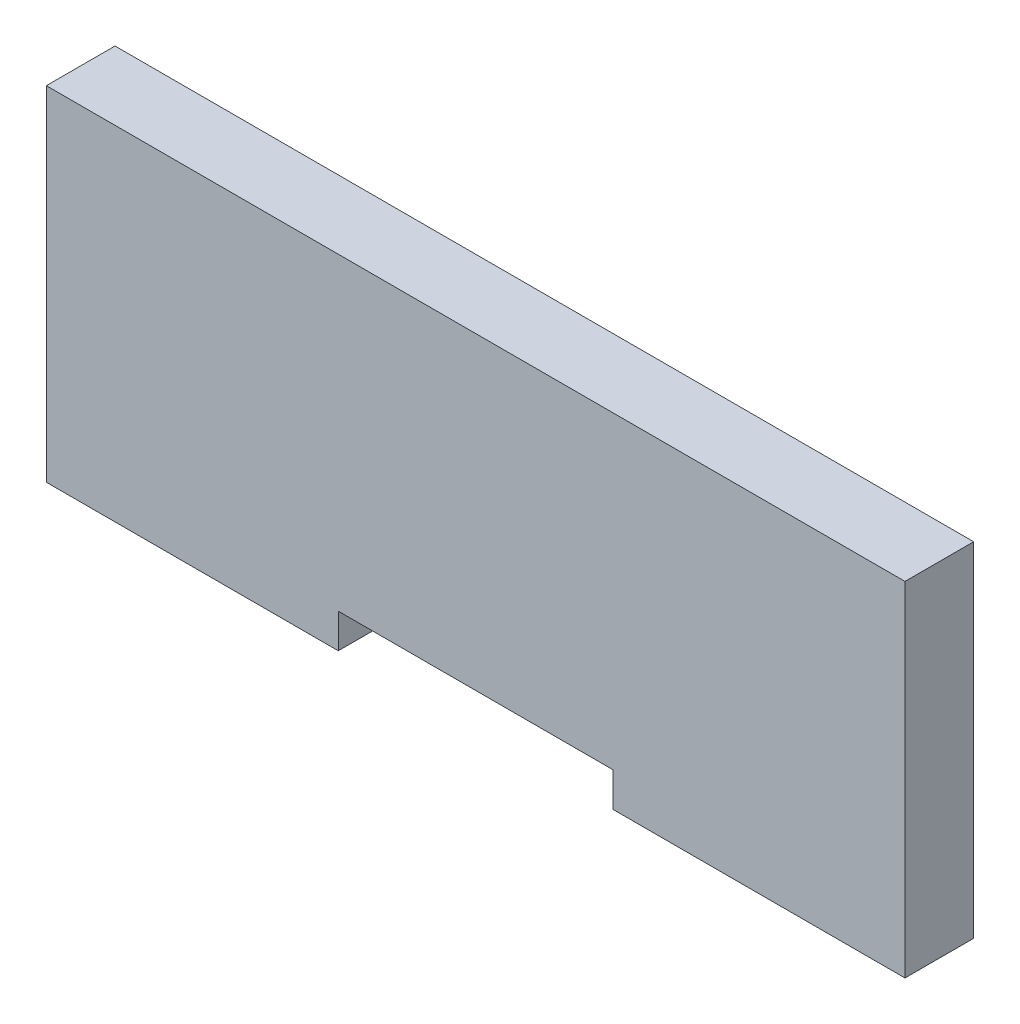
ISO-10303-21;
HEADER;
FILE_DESCRIPTION(('STEP AP214'),'2;1');
FILE_NAME('part.step','',(''),(''),'','','');
FILE_SCHEMA(('AUTOMOTIVE_DESIGN { 1 0 10303 214 1 1 1 1 }'));
ENDSEC;
DATA;
#1=APPLICATION_CONTEXT('core data for automotive mechanical design processes');
#2=APPLICATION_PROTOCOL_DEFINITION('international standard','automotive_design',2000,#1);
#3=PRODUCT_CONTEXT('',#1,'mechanical');
#4=PRODUCT('Part','Part','',(#3));
#5=PRODUCT_RELATED_PRODUCT_CATEGORY('part','',(#4));
#6=PRODUCT_DEFINITION_FORMATION('','',#4);
#7=PRODUCT_DEFINITION_CONTEXT('part definition',#1,'design');
#8=PRODUCT_DEFINITION('design','',#6,#7);
#9=PRODUCT_DEFINITION_SHAPE('','',#8);
#10=(LENGTH_UNIT() NAMED_UNIT(*) SI_UNIT(.MILLI.,.METRE.));
#11=(NAMED_UNIT(*) PLANE_ANGLE_UNIT() SI_UNIT($,.RADIAN.));
#12=(NAMED_UNIT(*) SI_UNIT($,.STERADIAN.) SOLID_ANGLE_UNIT());
#13=UNCERTAINTY_MEASURE_WITH_UNIT(LENGTH_MEASURE(1.E-05),#10,'distance_accuracy_value','');
#14=(GEOMETRIC_REPRESENTATION_CONTEXT(3) GLOBAL_UNCERTAINTY_ASSIGNED_CONTEXT((#13)) GLOBAL_UNIT_ASSIGNED_CONTEXT((#10,
#11,#12)) REPRESENTATION_CONTEXT('',''));
#15=CARTESIAN_POINT('',(0.,0.,0.));
#16=DIRECTION('',(0.,0.,1.));
#17=DIRECTION('',(1.,0.,0.));
#18=AXIS2_PLACEMENT_3D('',#15,#16,#17);
#19=CARTESIAN_POINT('',(-125.,-50.,20.));
#20=DIRECTION('',(1.,0.,0.));
#21=DIRECTION('',(0.,0.,-1.));
#22=AXIS2_PLACEMENT_3D('',#19,#20,#21);
#23=PLANE('',#22);
#24=DIRECTION('',(0.,-1.,0.));
#25=VECTOR('',#24,1.);
#26=CARTESIAN_POINT('',(-125.,-50.,0.));
#27=LINE('',#26,#25);
#28=CARTESIAN_POINT('',(-125.,50.,0.));
#29=VERTEX_POINT('',#28);
#30=CARTESIAN_POINT('',(-125.,-50.,0.));
#31=VERTEX_POINT('',#30);
#32=EDGE_CURVE('E147',#29,#31,#27,.T.);
#33=ORIENTED_EDGE('',*,*,#32,.T.);
#34=DIRECTION('',(0.,0.,-1.));
#35=VECTOR('',#34,1.);
#36=CARTESIAN_POINT('',(-125.,-50.,20.));
#37=LINE('',#36,#35);
#38=CARTESIAN_POINT('',(-125.,-50.,20.));
#39=VERTEX_POINT('',#38);
#40=EDGE_CURVE('E11',#39,#31,#37,.T.);
#41=ORIENTED_EDGE('',*,*,#40,.F.);
#42=DIRECTION('',(0.,-1.,0.));
#43=VECTOR('',#42,1.);
#44=CARTESIAN_POINT('',(-125.,-50.,20.));
#45=LINE('',#44,#43);
#46=CARTESIAN_POINT('',(-125.,50.,20.));
#47=VERTEX_POINT('',#46);
#48=EDGE_CURVE('E166',#47,#39,#45,.T.);
#49=ORIENTED_EDGE('',*,*,#48,.F.);
#50=DIRECTION('',(0.,0.,-1.));
#51=VECTOR('',#50,1.);
#52=CARTESIAN_POINT('',(-125.,50.,20.));
#53=LINE('',#52,#51);
#54=EDGE_CURVE('E145',#47,#29,#53,.T.);
#55=ORIENTED_EDGE('',*,*,#54,.T.);
#56=EDGE_LOOP('',(#33,#41,#49,#55));
#57=FACE_BOUND('',#56,.T.);
#58=ADVANCED_FACE('F44',(#57),#23,.F.);
#59=CARTESIAN_POINT('',(-40.,-50.,20.));
#60=DIRECTION('',(0.,1.,0.));
#61=DIRECTION('',(-1.,0.,0.));
#62=AXIS2_PLACEMENT_3D('',#59,#60,#61);
#63=PLANE('',#62);
#64=DIRECTION('',(1.,0.,0.));
#65=VECTOR('',#64,1.);
#66=CARTESIAN_POINT('',(-40.,-50.,0.));
#67=LINE('',#66,#65);
#68=CARTESIAN_POINT('',(-40.,-50.,0.));
#69=VERTEX_POINT('',#68);
#70=EDGE_CURVE('E148',#31,#69,#67,.T.);
#71=ORIENTED_EDGE('',*,*,#70,.T.);
#72=DIRECTION('',(0.,0.,-1.));
#73=VECTOR('',#72,1.);
#74=CARTESIAN_POINT('',(-40.,-50.,20.));
#75=LINE('',#74,#73);
#76=CARTESIAN_POINT('',(-40.,-50.,20.));
#77=VERTEX_POINT('',#76);
#78=EDGE_CURVE('E53',#77,#69,#75,.T.);
#79=ORIENTED_EDGE('',*,*,#78,.F.);
#80=DIRECTION('',(1.,0.,0.));
#81=VECTOR('',#80,1.);
#82=CARTESIAN_POINT('',(-40.,-50.,20.));
#83=LINE('',#82,#81);
#84=EDGE_CURVE('E103',#39,#77,#83,.T.);
#85=ORIENTED_EDGE('',*,*,#84,.F.);
#86=ORIENTED_EDGE('',*,*,#40,.T.);
#87=EDGE_LOOP('',(#71,#79,#85,#86));
#88=FACE_BOUND('',#87,.T.);
#89=ADVANCED_FACE('F215',(#88),#63,.F.);
#90=CARTESIAN_POINT('',(-40.,-50.,20.));
#91=DIRECTION('',(-1.,0.,0.));
#92=DIRECTION('',(0.,-1.,0.));
#93=AXIS2_PLACEMENT_3D('',#90,#91,#92);
#94=PLANE('',#93);
#95=DIRECTION('',(0.,1.,0.));
#96=VECTOR('',#95,1.);
#97=CARTESIAN_POINT('',(-40.,-50.,0.));
#98=LINE('',#97,#96);
#99=CARTESIAN_POINT('',(-40.,-40.,0.));
#100=VERTEX_POINT('',#99);
#101=EDGE_CURVE('E154',#69,#100,#98,.T.);
#102=ORIENTED_EDGE('',*,*,#101,.T.);
#103=DIRECTION('',(0.,0.,-1.));
#104=VECTOR('',#103,1.);
#105=CARTESIAN_POINT('',(-40.,-40.,20.));
#106=LINE('',#105,#104);
#107=CARTESIAN_POINT('',(-40.,-40.,20.));
#108=VERTEX_POINT('',#107);
#109=EDGE_CURVE('E177',#108,#100,#106,.T.);
#110=ORIENTED_EDGE('',*,*,#109,.F.);
#111=DIRECTION('',(0.,1.,0.));
#112=VECTOR('',#111,1.);
#113=CARTESIAN_POINT('',(-40.,-50.,20.));
#114=LINE('',#113,#112);
#115=EDGE_CURVE('E188',#77,#108,#114,.T.);
#116=ORIENTED_EDGE('',*,*,#115,.F.);
#117=ORIENTED_EDGE('',*,*,#78,.T.);
#118=EDGE_LOOP('',(#102,#110,#116,#117));
#119=FACE_BOUND('',#118,.T.);
#120=ADVANCED_FACE('F190',(#119),#94,.F.);
#121=CARTESIAN_POINT('',(40.,-40.,20.));
#122=DIRECTION('',(0.,1.,0.));
#123=DIRECTION('',(-1.,0.,0.));
#124=AXIS2_PLACEMENT_3D('',#121,#122,#123);
#125=PLANE('',#124);
#126=DIRECTION('',(1.,0.,0.));
#127=VECTOR('',#126,1.);
#128=CARTESIAN_POINT('',(40.,-40.,0.));
#129=LINE('',#128,#127);
#130=CARTESIAN_POINT('',(40.,-40.,0.));
#131=VERTEX_POINT('',#130);
#132=EDGE_CURVE('E157',#100,#131,#129,.T.);
#133=ORIENTED_EDGE('',*,*,#132,.T.);
#134=DIRECTION('',(0.,0.,-1.));
#135=VECTOR('',#134,1.);
#136=CARTESIAN_POINT('',(40.,-40.,20.));
#137=LINE('',#136,#135);
#138=CARTESIAN_POINT('',(40.,-40.,20.));
#139=VERTEX_POINT('',#138);
#140=EDGE_CURVE('E172',#139,#131,#137,.T.);
#141=ORIENTED_EDGE('',*,*,#140,.F.);
#142=DIRECTION('',(1.,0.,0.));
#143=VECTOR('',#142,1.);
#144=CARTESIAN_POINT('',(40.,-40.,20.));
#145=LINE('',#144,#143);
#146=EDGE_CURVE('E205',#108,#139,#145,.T.);
#147=ORIENTED_EDGE('',*,*,#146,.F.);
#148=ORIENTED_EDGE('',*,*,#109,.T.);
#149=EDGE_LOOP('',(#133,#141,#147,#148));
#150=FACE_BOUND('',#149,.T.);
#151=ADVANCED_FACE('F197',(#150),#125,.F.);
#152=CARTESIAN_POINT('',(40.,-50.,20.));
#153=DIRECTION('',(1.,0.,0.));
#154=DIRECTION('',(0.,1.,0.));
#155=AXIS2_PLACEMENT_3D('',#152,#153,#154);
#156=PLANE('',#155);
#157=DIRECTION('',(0.,-1.,0.));
#158=VECTOR('',#157,1.);
#159=CARTESIAN_POINT('',(40.,-50.,0.));
#160=LINE('',#159,#158);
#161=CARTESIAN_POINT('',(40.,-50.,0.));
#162=VERTEX_POINT('',#161);
#163=EDGE_CURVE('E159',#131,#162,#160,.T.);
#164=ORIENTED_EDGE('',*,*,#163,.T.);
#165=DIRECTION('',(0.,0.,-1.));
#166=VECTOR('',#165,1.);
#167=CARTESIAN_POINT('',(40.,-50.,20.));
#168=LINE('',#167,#166);
#169=CARTESIAN_POINT('',(40.,-50.,20.));
#170=VERTEX_POINT('',#169);
#171=EDGE_CURVE('E134',#170,#162,#168,.T.);
#172=ORIENTED_EDGE('',*,*,#171,.F.);
#173=DIRECTION('',(0.,-1.,0.));
#174=VECTOR('',#173,1.);
#175=CARTESIAN_POINT('',(40.,-50.,20.));
#176=LINE('',#175,#174);
#177=EDGE_CURVE('E125',#139,#170,#176,.T.);
#178=ORIENTED_EDGE('',*,*,#177,.F.);
#179=ORIENTED_EDGE('',*,*,#140,.T.);
#180=EDGE_LOOP('',(#164,#172,#178,#179));
#181=FACE_BOUND('',#180,.T.);
#182=ADVANCED_FACE('F200',(#181),#156,.F.);
#183=CARTESIAN_POINT('',(125.,-50.,20.));
#184=DIRECTION('',(0.,1.,0.));
#185=DIRECTION('',(-1.,0.,0.));
#186=AXIS2_PLACEMENT_3D('',#183,#184,#185);
#187=PLANE('',#186);
#188=DIRECTION('',(1.,0.,0.));
#189=VECTOR('',#188,1.);
#190=CARTESIAN_POINT('',(125.,-50.,0.));
#191=LINE('',#190,#189);
#192=CARTESIAN_POINT('',(125.,-50.,0.));
#193=VERTEX_POINT('',#192);
#194=EDGE_CURVE('E133',#162,#193,#191,.T.);
#195=ORIENTED_EDGE('',*,*,#194,.T.);
#196=DIRECTION('',(0.,0.,-1.));
#197=VECTOR('',#196,1.);
#198=CARTESIAN_POINT('',(125.,-50.,20.));
#199=LINE('',#198,#197);
#200=CARTESIAN_POINT('',(125.,-50.,20.));
#201=VERTEX_POINT('',#200);
#202=EDGE_CURVE('E127',#201,#193,#199,.T.);
#203=ORIENTED_EDGE('',*,*,#202,.F.);
#204=DIRECTION('',(1.,0.,0.));
#205=VECTOR('',#204,1.);
#206=CARTESIAN_POINT('',(125.,-50.,20.));
#207=LINE('',#206,#205);
#208=EDGE_CURVE('E119',#170,#201,#207,.T.);
#209=ORIENTED_EDGE('',*,*,#208,.F.);
#210=ORIENTED_EDGE('',*,*,#171,.T.);
#211=EDGE_LOOP('',(#195,#203,#209,#210));
#212=FACE_BOUND('',#211,.T.);
#213=ADVANCED_FACE('F131',(#212),#187,.F.);
#214=CARTESIAN_POINT('',(125.,-50.,20.));
#215=DIRECTION('',(-1.,0.,0.));
#216=DIRECTION('',(0.,-1.,0.));
#217=AXIS2_PLACEMENT_3D('',#214,#215,#216);
#218=PLANE('',#217);
#219=DIRECTION('',(0.,1.,0.));
#220=VECTOR('',#219,1.);
#221=CARTESIAN_POINT('',(125.,-50.,0.));
#222=LINE('',#221,#220);
#223=CARTESIAN_POINT('',(125.,50.,0.));
#224=VERTEX_POINT('',#223);
#225=EDGE_CURVE('E91',#193,#224,#222,.T.);
#226=ORIENTED_EDGE('',*,*,#225,.T.);
#227=DIRECTION('',(0.,0.,-1.));
#228=VECTOR('',#227,1.);
#229=CARTESIAN_POINT('',(125.,50.,20.));
#230=LINE('',#229,#228);
#231=CARTESIAN_POINT('',(125.,50.,20.));
#232=VERTEX_POINT('',#231);
#233=EDGE_CURVE('E136',#232,#224,#230,.T.);
#234=ORIENTED_EDGE('',*,*,#233,.F.);
#235=DIRECTION('',(0.,1.,0.));
#236=VECTOR('',#235,1.);
#237=CARTESIAN_POINT('',(125.,-50.,20.));
#238=LINE('',#237,#236);
#239=EDGE_CURVE('E122',#201,#232,#238,.T.);
#240=ORIENTED_EDGE('',*,*,#239,.F.);
#241=ORIENTED_EDGE('',*,*,#202,.T.);
#242=EDGE_LOOP('',(#226,#234,#240,#241));
#243=FACE_BOUND('',#242,.T.);
#244=ADVANCED_FACE('F138',(#243),#218,.F.);
#245=CARTESIAN_POINT('',(125.,50.,20.));
#246=DIRECTION('',(0.,-1.,0.));
#247=DIRECTION('',(1.,0.,0.));
#248=AXIS2_PLACEMENT_3D('',#245,#246,#247);
#249=PLANE('',#248);
#250=DIRECTION('',(-1.,0.,0.));
#251=VECTOR('',#250,1.);
#252=CARTESIAN_POINT('',(125.,50.,0.));
#253=LINE('',#252,#251);
#254=EDGE_CURVE('E100',#224,#29,#253,.T.);
#255=ORIENTED_EDGE('',*,*,#254,.T.);
#256=ORIENTED_EDGE('',*,*,#54,.F.);
#257=DIRECTION('',(-1.,0.,0.));
#258=VECTOR('',#257,1.);
#259=CARTESIAN_POINT('',(125.,50.,20.));
#260=LINE('',#259,#258);
#261=EDGE_CURVE('E62',#232,#47,#260,.T.);
#262=ORIENTED_EDGE('',*,*,#261,.F.);
#263=ORIENTED_EDGE('',*,*,#233,.T.);
#264=EDGE_LOOP('',(#255,#256,#262,#263));
#265=FACE_BOUND('',#264,.T.);
#266=ADVANCED_FACE('F229',(#265),#249,.F.);
#267=CARTESIAN_POINT('',(0.,0.,20.));
#268=DIRECTION('',(0.,0.,1.));
#269=DIRECTION('',(1.,0.,0.));
#270=AXIS2_PLACEMENT_3D('',#267,#268,#269);
#271=PLANE('',#270);
#272=ORIENTED_EDGE('',*,*,#48,.T.);
#273=ORIENTED_EDGE('',*,*,#84,.T.);
#274=ORIENTED_EDGE('',*,*,#115,.T.);
#275=ORIENTED_EDGE('',*,*,#146,.T.);
#276=ORIENTED_EDGE('',*,*,#177,.T.);
#277=ORIENTED_EDGE('',*,*,#208,.T.);
#278=ORIENTED_EDGE('',*,*,#239,.T.);
#279=ORIENTED_EDGE('',*,*,#261,.T.);
#280=EDGE_LOOP('',(#272,#273,#274,#275,#276,#277,#278,#279));
#281=FACE_BOUND('',#280,.T.);
#282=ADVANCED_FACE('F120',(#281),#271,.T.);
#283=CARTESIAN_POINT('',(0.,0.,0.));
#284=DIRECTION('',(0.,0.,1.));
#285=DIRECTION('',(1.,0.,0.));
#286=AXIS2_PLACEMENT_3D('',#283,#284,#285);
#287=PLANE('',#286);
#288=ORIENTED_EDGE('',*,*,#32,.F.);
#289=ORIENTED_EDGE('',*,*,#254,.F.);
#290=ORIENTED_EDGE('',*,*,#225,.F.);
#291=ORIENTED_EDGE('',*,*,#194,.F.);
#292=ORIENTED_EDGE('',*,*,#163,.F.);
#293=ORIENTED_EDGE('',*,*,#132,.F.);
#294=ORIENTED_EDGE('',*,*,#101,.F.);
#295=ORIENTED_EDGE('',*,*,#70,.F.);
#296=EDGE_LOOP('',(#288,#289,#290,#291,#292,#293,#294,#295));
#297=FACE_BOUND('',#296,.T.);
#298=ADVANCED_FACE('F194',(#297),#287,.F.);
#299=CLOSED_SHELL('',(#58,#89,#120,#151,#182,#213,#244,#266,#282,#298));
#300=MANIFOLD_SOLID_BREP('B2',#299);
#301=ADVANCED_BREP_SHAPE_REPRESENTATION('',(#18,#300),#14);
#302=SHAPE_DEFINITION_REPRESENTATION(#9,#301);
ENDSEC;
END-ISO-10303-21;
